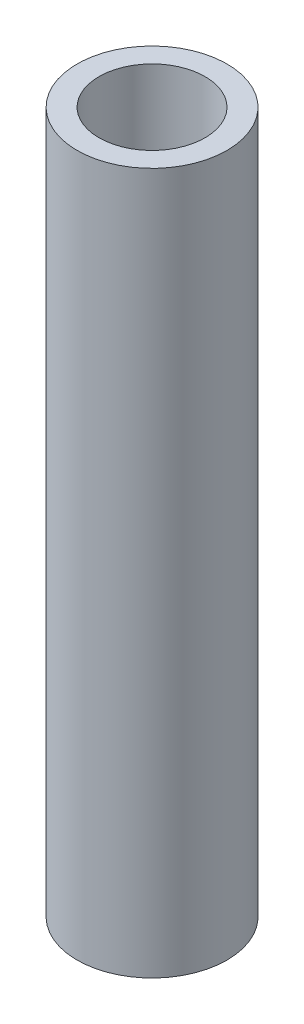
ISO-10303-21;
HEADER;
FILE_DESCRIPTION(('STEP AP214'),'2;1');
FILE_NAME('part.step','',(''),(''),'','','');
FILE_SCHEMA(('AUTOMOTIVE_DESIGN { 1 0 10303 214 1 1 1 1 }'));
ENDSEC;
DATA;
#1=APPLICATION_CONTEXT('core data for automotive mechanical design processes');
#2=APPLICATION_PROTOCOL_DEFINITION('international standard','automotive_design',2000,#1);
#3=PRODUCT_CONTEXT('',#1,'mechanical');
#4=PRODUCT('Part','Part','',(#3));
#5=PRODUCT_RELATED_PRODUCT_CATEGORY('part','',(#4));
#6=PRODUCT_DEFINITION_FORMATION('','',#4);
#7=PRODUCT_DEFINITION_CONTEXT('part definition',#1,'design');
#8=PRODUCT_DEFINITION('design','',#6,#7);
#9=PRODUCT_DEFINITION_SHAPE('','',#8);
#10=(LENGTH_UNIT() NAMED_UNIT(*) SI_UNIT(.MILLI.,.METRE.));
#11=(NAMED_UNIT(*) PLANE_ANGLE_UNIT() SI_UNIT($,.RADIAN.));
#12=(NAMED_UNIT(*) SI_UNIT($,.STERADIAN.) SOLID_ANGLE_UNIT());
#13=UNCERTAINTY_MEASURE_WITH_UNIT(LENGTH_MEASURE(1.E-05),#10,'distance_accuracy_value','');
#14=(GEOMETRIC_REPRESENTATION_CONTEXT(3) GLOBAL_UNCERTAINTY_ASSIGNED_CONTEXT((#13)) GLOBAL_UNIT_ASSIGNED_CONTEXT((#10,
#11,#12)) REPRESENTATION_CONTEXT('',''));
#15=CARTESIAN_POINT('',(0.,0.,0.));
#16=DIRECTION('',(0.,0.,1.));
#17=DIRECTION('',(1.,0.,0.));
#18=AXIS2_PLACEMENT_3D('',#15,#16,#17);
#19=CARTESIAN_POINT('',(0.,80.,0.));
#20=DIRECTION('',(0.,1.,0.));
#21=DIRECTION('',(0.,0.,1.));
#22=AXIS2_PLACEMENT_3D('',#19,#20,#21);
#23=PLANE('',#22);
#24=CARTESIAN_POINT('',(0.,80.,0.));
#25=DIRECTION('',(0.,1.,0.));
#26=DIRECTION('',(1.,0.,0.));
#27=AXIS2_PLACEMENT_3D('',#24,#25,#26);
#28=CIRCLE('',#27,8.55);
#29=CARTESIAN_POINT('',(8.55,80.,0.));
#30=VERTEX_POINT('',#29);
#31=EDGE_CURVE('E11',#30,#30,#28,.T.);
#32=ORIENTED_EDGE('',*,*,#31,.T.);
#33=EDGE_LOOP('',(#32));
#34=FACE_BOUND('',#33,.T.);
#35=CARTESIAN_POINT('',(0.,80.,0.));
#36=DIRECTION('',(0.,1.,0.));
#37=DIRECTION('',(0.,0.,1.));
#38=AXIS2_PLACEMENT_3D('',#35,#36,#37);
#39=CIRCLE('',#38,6.05);
#40=CARTESIAN_POINT('',(0.,80.,6.05));
#41=VERTEX_POINT('',#40);
#42=EDGE_CURVE('E62',#41,#41,#39,.T.);
#43=ORIENTED_EDGE('',*,*,#42,.F.);
#44=EDGE_LOOP('',(#43));
#45=FACE_BOUND('',#44,.T.);
#46=ADVANCED_FACE('F49',(#34,#45),#23,.T.);
#47=CARTESIAN_POINT('',(0.,0.,0.));
#48=DIRECTION('',(0.,1.,0.));
#49=DIRECTION('',(0.,0.,1.));
#50=AXIS2_PLACEMENT_3D('',#47,#48,#49);
#51=PLANE('',#50);
#52=CARTESIAN_POINT('',(0.,0.,0.));
#53=DIRECTION('',(0.,1.,0.));
#54=DIRECTION('',(1.,0.,0.));
#55=AXIS2_PLACEMENT_3D('',#52,#53,#54);
#56=CIRCLE('',#55,8.55);
#57=CARTESIAN_POINT('',(8.55,0.,0.));
#58=VERTEX_POINT('',#57);
#59=EDGE_CURVE('E53',#58,#58,#56,.T.);
#60=ORIENTED_EDGE('',*,*,#59,.F.);
#61=EDGE_LOOP('',(#60));
#62=FACE_BOUND('',#61,.T.);
#63=CARTESIAN_POINT('',(0.,0.,0.));
#64=DIRECTION('',(0.,1.,0.));
#65=DIRECTION('',(0.,0.,1.));
#66=AXIS2_PLACEMENT_3D('',#63,#64,#65);
#67=CIRCLE('',#66,6.05);
#68=CARTESIAN_POINT('',(0.,0.,6.05));
#69=VERTEX_POINT('',#68);
#70=EDGE_CURVE('E64',#69,#69,#67,.T.);
#71=ORIENTED_EDGE('',*,*,#70,.T.);
#72=EDGE_LOOP('',(#71));
#73=FACE_BOUND('',#72,.T.);
#74=ADVANCED_FACE('F76',(#62,#73),#51,.F.);
#75=CARTESIAN_POINT('',(0.,80.,0.));
#76=DIRECTION('',(0.,-1.,0.));
#77=DIRECTION('',(0.,0.,-1.));
#78=AXIS2_PLACEMENT_3D('',#75,#76,#77);
#79=CYLINDRICAL_SURFACE('',#78,8.55);
#80=ORIENTED_EDGE('',*,*,#31,.F.);
#81=EDGE_LOOP('',(#80));
#82=FACE_BOUND('',#81,.T.);
#83=ORIENTED_EDGE('',*,*,#59,.T.);
#84=EDGE_LOOP('',(#83));
#85=FACE_BOUND('',#84,.T.);
#86=ADVANCED_FACE('F51',(#82,#85),#79,.T.);
#87=CARTESIAN_POINT('',(0.,80.,0.));
#88=DIRECTION('',(0.,-1.,0.));
#89=DIRECTION('',(0.,0.,-1.));
#90=AXIS2_PLACEMENT_3D('',#87,#88,#89);
#91=CYLINDRICAL_SURFACE('',#90,6.05);
#92=ORIENTED_EDGE('',*,*,#42,.T.);
#93=EDGE_LOOP('',(#92));
#94=FACE_BOUND('',#93,.T.);
#95=ORIENTED_EDGE('',*,*,#70,.F.);
#96=EDGE_LOOP('',(#95));
#97=FACE_BOUND('',#96,.T.);
#98=ADVANCED_FACE('F72',(#94,#97),#91,.F.);
#99=CLOSED_SHELL('',(#46,#74,#86,#98));
#100=MANIFOLD_SOLID_BREP('B2',#99);
#101=ADVANCED_BREP_SHAPE_REPRESENTATION('',(#18,#100),#14);
#102=SHAPE_DEFINITION_REPRESENTATION(#9,#101);
ENDSEC;
END-ISO-10303-21;
